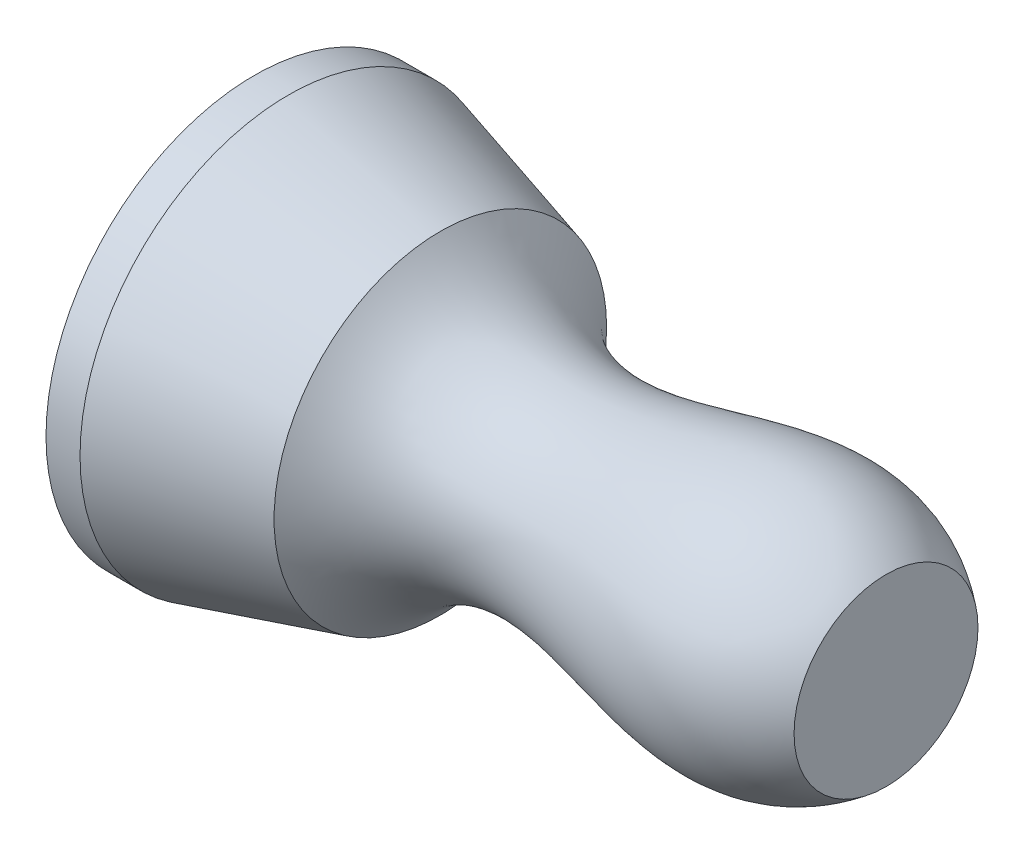
ISO-10303-21;
HEADER;
FILE_DESCRIPTION(('STEP AP214'),'2;1');
FILE_NAME('part.step','',(''),(''),'','','');
FILE_SCHEMA(('AUTOMOTIVE_DESIGN { 1 0 10303 214 1 1 1 1 }'));
ENDSEC;
DATA;
#1=APPLICATION_CONTEXT('core data for automotive mechanical design processes');
#2=APPLICATION_PROTOCOL_DEFINITION('international standard','automotive_design',2000,#1);
#3=PRODUCT_CONTEXT('',#1,'mechanical');
#4=PRODUCT('Part','Part','',(#3));
#5=PRODUCT_RELATED_PRODUCT_CATEGORY('part','',(#4));
#6=PRODUCT_DEFINITION_FORMATION('','',#4);
#7=PRODUCT_DEFINITION_CONTEXT('part definition',#1,'design');
#8=PRODUCT_DEFINITION('design','',#6,#7);
#9=PRODUCT_DEFINITION_SHAPE('','',#8);
#10=(LENGTH_UNIT() NAMED_UNIT(*) SI_UNIT(.MILLI.,.METRE.));
#11=(NAMED_UNIT(*) PLANE_ANGLE_UNIT() SI_UNIT($,.RADIAN.));
#12=(NAMED_UNIT(*) SI_UNIT($,.STERADIAN.) SOLID_ANGLE_UNIT());
#13=UNCERTAINTY_MEASURE_WITH_UNIT(LENGTH_MEASURE(1.E-05),#10,'distance_accuracy_value','');
#14=(GEOMETRIC_REPRESENTATION_CONTEXT(3) GLOBAL_UNCERTAINTY_ASSIGNED_CONTEXT((#13)) GLOBAL_UNIT_ASSIGNED_CONTEXT((#10,
#11,#12)) REPRESENTATION_CONTEXT('',''));
#15=CARTESIAN_POINT('',(0.,0.,0.));
#16=DIRECTION('',(0.,0.,1.));
#17=DIRECTION('',(1.,0.,0.));
#18=AXIS2_PLACEMENT_3D('',#15,#16,#17);
#19=CARTESIAN_POINT('',(0.,0.,0.));
#20=DIRECTION('',(-1.,0.,0.));
#21=DIRECTION('',(0.,0.,1.));
#22=AXIS2_PLACEMENT_3D('',#19,#20,#21);
#23=PLANE('',#22);
#24=CARTESIAN_POINT('',(0.,0.,0.));
#25=DIRECTION('',(1.,0.,0.));
#26=DIRECTION('',(0.,0.,-1.));
#27=AXIS2_PLACEMENT_3D('',#24,#25,#26);
#28=CIRCLE('',#27,19.0083194675541);
#29=CARTESIAN_POINT('',(0.,0.,-19.0083194675541));
#30=VERTEX_POINT('',#29);
#31=EDGE_CURVE('E10',#30,#30,#28,.T.);
#32=ORIENTED_EDGE('',*,*,#31,.F.);
#33=EDGE_LOOP('',(#32));
#34=FACE_BOUND('',#33,.T.);
#35=ADVANCED_FACE('F31',(#34),#23,.T.);
#36=CARTESIAN_POINT('',(57.5904684722263,0.,0.));
#37=DIRECTION('',(1.,0.,0.));
#38=DIRECTION('',(0.,0.,-1.));
#39=AXIS2_PLACEMENT_3D('',#36,#37,#38);
#40=CYLINDRICAL_SURFACE('',#39,19.0083194675541);
#41=ORIENTED_EDGE('',*,*,#31,.T.);
#42=EDGE_LOOP('',(#41));
#43=FACE_BOUND('',#42,.T.);
#44=CARTESIAN_POINT('',(3.10339909674356,0.,0.));
#45=DIRECTION('',(1.,0.,0.));
#46=DIRECTION('',(0.,0.,-1.));
#47=AXIS2_PLACEMENT_3D('',#44,#45,#46);
#48=CIRCLE('',#47,19.0083194675541);
#49=CARTESIAN_POINT('',(3.10339909674356,0.,-19.0083194675541));
#50=VERTEX_POINT('',#49);
#51=EDGE_CURVE('E37',#50,#50,#48,.T.);
#52=ORIENTED_EDGE('',*,*,#51,.F.);
#53=EDGE_LOOP('',(#52));
#54=FACE_BOUND('',#53,.T.);
#55=ADVANCED_FACE('F65',(#43,#54),#40,.T.);
#56=CARTESIAN_POINT('',(16.9493337723056,0.,0.));
#57=DIRECTION('',(-1.,0.,0.));
#58=DIRECTION('',(0.,0.,1.));
#59=AXIS2_PLACEMENT_3D('',#56,#57,#58);
#60=CONICAL_SURFACE('',#59,15.1605772052452,0.271057431920437);
#61=ORIENTED_EDGE('',*,*,#51,.T.);
#62=EDGE_LOOP('',(#61));
#63=FACE_BOUND('',#62,.T.);
#64=CARTESIAN_POINT('',(16.9493337723056,0.,0.));
#65=DIRECTION('',(1.,0.,0.));
#66=DIRECTION('',(0.,0.,-1.));
#67=AXIS2_PLACEMENT_3D('',#64,#65,#66);
#68=CIRCLE('',#67,15.1605772052452);
#69=CARTESIAN_POINT('',(16.9493337723056,0.,-15.1605772052452));
#70=VERTEX_POINT('',#69);
#71=EDGE_CURVE('E41',#70,#70,#68,.T.);
#72=ORIENTED_EDGE('',*,*,#71,.F.);
#73=EDGE_LOOP('',(#72));
#74=FACE_BOUND('',#73,.T.);
#75=ADVANCED_FACE('F62',(#63,#74),#60,.T.);
#76=CARTESIAN_POINT('',(57.5904684722263,0.,-8.38581971735108));
#77=CARTESIAN_POINT('',(43.8737582316292,0.,-19.1512027226753));
#78=CARTESIAN_POINT('',(29.0360597496627,0.,0.365645484316847));
#79=CARTESIAN_POINT('',(16.9493337723056,0.,-15.1605772052452));
#80=B_SPLINE_CURVE_WITH_KNOTS('',3,(#76,#77,#78,#79),.UNSPECIFIED.,.F.,.F.,(4,4),(0.,1.),.UNSPECIFIED.);
#81=CARTESIAN_POINT('',(57.5904684722263,0.,0.));
#82=DIRECTION('',(1.,0.,0.));
#83=AXIS1_PLACEMENT('',#81,#82);
#84=SURFACE_OF_REVOLUTION('',#80,#83);
#85=ORIENTED_EDGE('',*,*,#71,.T.);
#86=EDGE_LOOP('',(#85));
#87=FACE_BOUND('',#86,.T.);
#88=CARTESIAN_POINT('',(57.5904684722263,0.,0.));
#89=DIRECTION('',(1.,0.,0.));
#90=DIRECTION('',(0.,0.,-1.));
#91=AXIS2_PLACEMENT_3D('',#88,#89,#90);
#92=CIRCLE('',#91,8.38581971735108);
#93=CARTESIAN_POINT('',(57.5904684722263,0.,-8.38581971735108));
#94=VERTEX_POINT('',#93);
#95=EDGE_CURVE('E45',#94,#94,#92,.T.);
#96=ORIENTED_EDGE('',*,*,#95,.F.);
#97=EDGE_LOOP('',(#96));
#98=FACE_BOUND('',#97,.T.);
#99=ADVANCED_FACE('F57',(#87,#98),#84,.F.);
#100=CARTESIAN_POINT('',(57.5904684722263,0.,-8.38581971735108));
#101=DIRECTION('',(1.,0.,0.));
#102=DIRECTION('',(0.,0.,-1.));
#103=AXIS2_PLACEMENT_3D('',#100,#101,#102);
#104=PLANE('',#103);
#105=ORIENTED_EDGE('',*,*,#95,.T.);
#106=EDGE_LOOP('',(#105));
#107=FACE_BOUND('',#106,.T.);
#108=ADVANCED_FACE('F61',(#107),#104,.T.);
#109=CLOSED_SHELL('',(#35,#55,#75,#99,#108));
#110=MANIFOLD_SOLID_BREP('B2',#109);
#111=ADVANCED_BREP_SHAPE_REPRESENTATION('',(#18,#110),#14);
#112=SHAPE_DEFINITION_REPRESENTATION(#9,#111);
ENDSEC;
END-ISO-10303-21;
